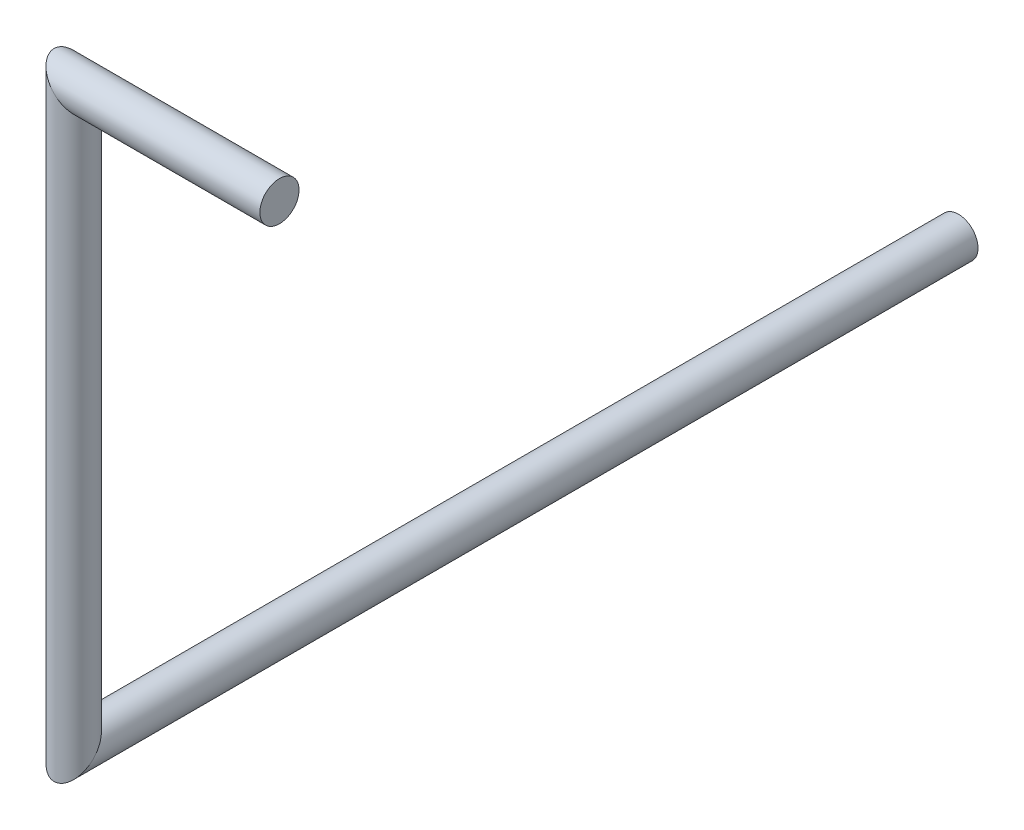
ISO-10303-21;
HEADER;
FILE_DESCRIPTION(('STEP AP214'),'2;1');
FILE_NAME('part.step','',(''),(''),'','','');
FILE_SCHEMA(('AUTOMOTIVE_DESIGN { 1 0 10303 214 1 1 1 1 }'));
ENDSEC;
DATA;
#1=APPLICATION_CONTEXT('core data for automotive mechanical design processes');
#2=APPLICATION_PROTOCOL_DEFINITION('international standard','automotive_design',2000,#1);
#3=PRODUCT_CONTEXT('',#1,'mechanical');
#4=PRODUCT('Part','Part','',(#3));
#5=PRODUCT_RELATED_PRODUCT_CATEGORY('part','',(#4));
#6=PRODUCT_DEFINITION_FORMATION('','',#4);
#7=PRODUCT_DEFINITION_CONTEXT('part definition',#1,'design');
#8=PRODUCT_DEFINITION('design','',#6,#7);
#9=PRODUCT_DEFINITION_SHAPE('','',#8);
#10=(LENGTH_UNIT() NAMED_UNIT(*) SI_UNIT(.MILLI.,.METRE.));
#11=(NAMED_UNIT(*) PLANE_ANGLE_UNIT() SI_UNIT($,.RADIAN.));
#12=(NAMED_UNIT(*) SI_UNIT($,.STERADIAN.) SOLID_ANGLE_UNIT());
#13=UNCERTAINTY_MEASURE_WITH_UNIT(LENGTH_MEASURE(1.E-05),#10,'distance_accuracy_value','');
#14=(GEOMETRIC_REPRESENTATION_CONTEXT(3) GLOBAL_UNCERTAINTY_ASSIGNED_CONTEXT((#13)) GLOBAL_UNIT_ASSIGNED_CONTEXT((#10,
#11,#12)) REPRESENTATION_CONTEXT('',''));
#15=CARTESIAN_POINT('',(0.,0.,0.));
#16=DIRECTION('',(0.,0.,1.));
#17=DIRECTION('',(1.,0.,0.));
#18=AXIS2_PLACEMENT_3D('',#15,#16,#17);
#19=CARTESIAN_POINT('',(0.,0.,10.));
#20=DIRECTION('',(0.,0.,-1.));
#21=DIRECTION('',(-1.,0.,0.));
#22=AXIS2_PLACEMENT_3D('',#19,#20,#21);
#23=CYLINDRICAL_SURFACE('',#22,9.525);
#24=CARTESIAN_POINT('',(0.,0.,0.));
#25=DIRECTION('',(0.,0.,1.));
#26=DIRECTION('',(1.,0.,0.));
#27=AXIS2_PLACEMENT_3D('',#24,#25,#26);
#28=CIRCLE('',#27,9.525);
#29=CARTESIAN_POINT('',(9.525,0.,0.));
#30=VERTEX_POINT('',#29);
#31=EDGE_CURVE('E11',#30,#30,#28,.T.);
#32=ORIENTED_EDGE('',*,*,#31,.T.);
#33=EDGE_LOOP('',(#32));
#34=FACE_BOUND('',#33,.T.);
#35=CARTESIAN_POINT('',(0.,0.,430.));
#36=DIRECTION('',(0.,0.707106781186547,0.707106781186547));
#37=DIRECTION('',(0.,-0.707106781186548,0.707106781186548));
#38=AXIS2_PLACEMENT_3D('',#35,#36,#37);
#39=ELLIPSE('',#38,13.4703841816037,9.525);
#40=CARTESIAN_POINT('',(0.,-9.525,439.525));
#41=VERTEX_POINT('',#40);
#42=EDGE_CURVE('E40',#41,#41,#39,.F.);
#43=ORIENTED_EDGE('',*,*,#42,.T.);
#44=EDGE_LOOP('',(#43));
#45=FACE_BOUND('',#44,.T.);
#46=ADVANCED_FACE('F33',(#34,#45),#23,.T.);
#47=CARTESIAN_POINT('',(0.,0.,0.));
#48=DIRECTION('',(0.,0.,1.));
#49=DIRECTION('',(1.,0.,0.));
#50=AXIS2_PLACEMENT_3D('',#47,#48,#49);
#51=PLANE('',#50);
#52=ORIENTED_EDGE('',*,*,#31,.F.);
#53=EDGE_LOOP('',(#52));
#54=FACE_BOUND('',#53,.T.);
#55=ADVANCED_FACE('F63',(#54),#51,.F.);
#56=CARTESIAN_POINT('',(100.,280.,430.));
#57=DIRECTION('',(1.,0.,0.));
#58=DIRECTION('',(0.,-1.,0.));
#59=AXIS2_PLACEMENT_3D('',#56,#57,#58);
#60=PLANE('',#59);
#61=CARTESIAN_POINT('',(100.,280.,430.));
#62=DIRECTION('',(1.,0.,0.));
#63=DIRECTION('',(0.,-1.,0.));
#64=AXIS2_PLACEMENT_3D('',#61,#62,#63);
#65=CIRCLE('',#64,9.525);
#66=CARTESIAN_POINT('',(100.,270.475,430.));
#67=VERTEX_POINT('',#66);
#68=EDGE_CURVE('E45',#67,#67,#65,.T.);
#69=ORIENTED_EDGE('',*,*,#68,.T.);
#70=EDGE_LOOP('',(#69));
#71=FACE_BOUND('',#70,.T.);
#72=ADVANCED_FACE('F67',(#71),#60,.T.);
#73=CARTESIAN_POINT('',(-10.5774999999999,280.,430.));
#74=DIRECTION('',(1.,0.,0.));
#75=DIRECTION('',(0.,0.,-1.));
#76=AXIS2_PLACEMENT_3D('',#73,#74,#75);
#77=CYLINDRICAL_SURFACE('',#76,9.525);
#78=CARTESIAN_POINT('',(0.,280.,430.));
#79=DIRECTION('',(0.707106781186548,0.707106781186548,0.));
#80=DIRECTION('',(-0.707106781186548,0.707106781186548,0.));
#81=AXIS2_PLACEMENT_3D('',#78,#79,#80);
#82=ELLIPSE('',#81,13.4703841816037,9.525);
#83=CARTESIAN_POINT('',(-9.525,289.525,430.));
#84=VERTEX_POINT('',#83);
#85=EDGE_CURVE('E50',#84,#84,#82,.F.);
#86=ORIENTED_EDGE('',*,*,#85,.F.);
#87=EDGE_LOOP('',(#86));
#88=FACE_BOUND('',#87,.T.);
#89=ORIENTED_EDGE('',*,*,#68,.F.);
#90=EDGE_LOOP('',(#89));
#91=FACE_BOUND('',#90,.T.);
#92=ADVANCED_FACE('F61',(#88,#91),#77,.T.);
#93=CARTESIAN_POINT('',(0.,-21.0549999999999,430.));
#94=DIRECTION('',(0.,1.,0.));
#95=DIRECTION('',(0.,0.,1.));
#96=AXIS2_PLACEMENT_3D('',#93,#94,#95);
#97=CYLINDRICAL_SURFACE('',#96,9.525);
#98=ORIENTED_EDGE('',*,*,#42,.F.);
#99=EDGE_LOOP('',(#98));
#100=FACE_BOUND('',#99,.T.);
#101=ORIENTED_EDGE('',*,*,#85,.T.);
#102=EDGE_LOOP('',(#101));
#103=FACE_BOUND('',#102,.T.);
#104=ADVANCED_FACE('F55',(#100,#103),#97,.T.);
#105=CLOSED_SHELL('',(#46,#55,#72,#92,#104));
#106=MANIFOLD_SOLID_BREP('B2',#105);
#107=ADVANCED_BREP_SHAPE_REPRESENTATION('',(#18,#106),#14);
#108=SHAPE_DEFINITION_REPRESENTATION(#9,#107);
ENDSEC;
END-ISO-10303-21;
